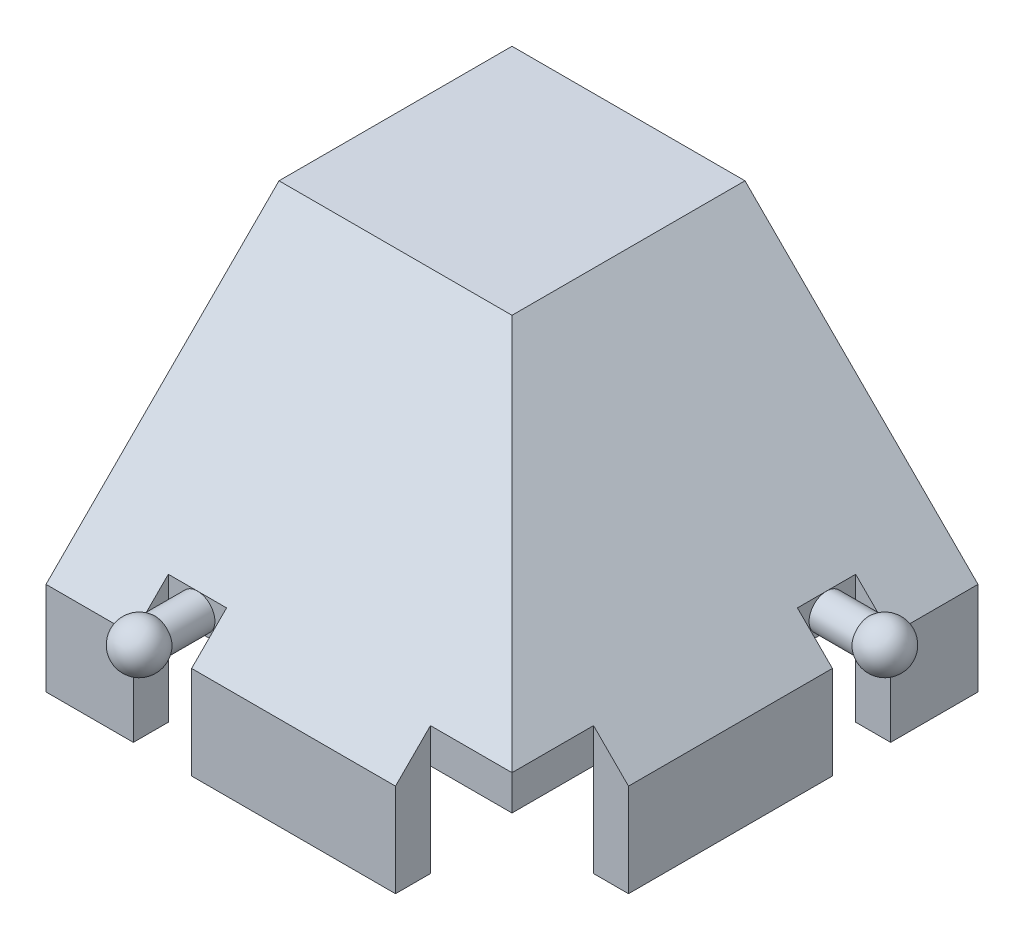
ISO-10303-21;
HEADER;
FILE_DESCRIPTION(('STEP AP214'),'2;1');
FILE_NAME('part.step','',(''),(''),'','','');
FILE_SCHEMA(('AUTOMOTIVE_DESIGN { 1 0 10303 214 1 1 1 1 }'));
ENDSEC;
DATA;
#1=APPLICATION_CONTEXT('core data for automotive mechanical design processes');
#2=APPLICATION_PROTOCOL_DEFINITION('international standard','automotive_design',2000,#1);
#3=PRODUCT_CONTEXT('',#1,'mechanical');
#4=PRODUCT('Part','Part','',(#3));
#5=PRODUCT_RELATED_PRODUCT_CATEGORY('part','',(#4));
#6=PRODUCT_DEFINITION_FORMATION('','',#4);
#7=PRODUCT_DEFINITION_CONTEXT('part definition',#1,'design');
#8=PRODUCT_DEFINITION('design','',#6,#7);
#9=PRODUCT_DEFINITION_SHAPE('','',#8);
#10=(LENGTH_UNIT() NAMED_UNIT(*) SI_UNIT(.MILLI.,.METRE.));
#11=(NAMED_UNIT(*) PLANE_ANGLE_UNIT() SI_UNIT($,.RADIAN.));
#12=(NAMED_UNIT(*) SI_UNIT($,.STERADIAN.) SOLID_ANGLE_UNIT());
#13=UNCERTAINTY_MEASURE_WITH_UNIT(LENGTH_MEASURE(1.E-05),#10,'distance_accuracy_value','');
#14=(GEOMETRIC_REPRESENTATION_CONTEXT(3) GLOBAL_UNCERTAINTY_ASSIGNED_CONTEXT((#13)) GLOBAL_UNIT_ASSIGNED_CONTEXT((#10,
#11,#12)) REPRESENTATION_CONTEXT('',''));
#15=CARTESIAN_POINT('',(0.,0.,0.));
#16=DIRECTION('',(0.,0.,1.));
#17=DIRECTION('',(1.,0.,0.));
#18=AXIS2_PLACEMENT_3D('',#15,#16,#17);
#19=CARTESIAN_POINT('',(15.3407897296246,20.,-8.37628865979381));
#20=DIRECTION('',(1.,0.,0.));
#21=DIRECTION('',(0.,0.,-1.));
#22=AXIS2_PLACEMENT_3D('',#19,#20,#21);
#23=PLANE('',#22);
#24=CARTESIAN_POINT('',(15.3407897296246,1.5,-5.87628865979381));
#25=DIRECTION('',(1.,0.,0.));
#26=DIRECTION('',(0.,0.,-1.));
#27=AXIS2_PLACEMENT_3D('',#24,#25,#26);
#28=CIRCLE('',#27,1.5);
#29=CARTESIAN_POINT('',(15.3407897296245,3.,-5.87628865979381));
#30=VERTEX_POINT('',#29);
#31=CARTESIAN_POINT('',(15.3407897296246,0.,-5.87628865979381));
#32=VERTEX_POINT('',#31);
#33=EDGE_CURVE('E240',#30,#32,#28,.T.);
#34=ORIENTED_EDGE('',*,*,#33,.F.);
#35=DIRECTION('',(0.,0.,-1.));
#36=VECTOR('',#35,1.);
#37=CARTESIAN_POINT('',(15.3407897296246,2.99999999999993,0.));
#38=LINE('',#37,#36);
#39=CARTESIAN_POINT('',(15.3407897296246,2.99999999999993,-3.37628865979381));
#40=VERTEX_POINT('',#39);
#41=EDGE_CURVE('E220',#40,#30,#38,.T.);
#42=ORIENTED_EDGE('',*,*,#41,.F.);
#43=DIRECTION('',(0.,-1.,0.));
#44=VECTOR('',#43,1.);
#45=CARTESIAN_POINT('',(15.3407897296246,20.,-3.37628865979381));
#46=LINE('',#45,#44);
#47=CARTESIAN_POINT('',(15.3407897296246,0.,-3.37628865979381));
#48=VERTEX_POINT('',#47);
#49=EDGE_CURVE('E383',#40,#48,#46,.T.);
#50=ORIENTED_EDGE('',*,*,#49,.T.);
#51=DIRECTION('',(0.,0.,1.));
#52=VECTOR('',#51,1.);
#53=CARTESIAN_POINT('',(15.3407897296246,0.,-8.37628865979381));
#54=LINE('',#53,#52);
#55=EDGE_CURVE('E236',#32,#48,#54,.T.);
#56=ORIENTED_EDGE('',*,*,#55,.F.);
#57=EDGE_LOOP('',(#34,#42,#50,#56));
#58=FACE_BOUND('',#57,.T.);
#59=ADVANCED_FACE('F47',(#58),#23,.T.);
#60=CARTESIAN_POINT('',(-11.6592102703754,1.49999999999993,26.1237113402062));
#61=DIRECTION('',(0.,0.,-1.));
#62=DIRECTION('',(-1.,0.,0.));
#63=AXIS2_PLACEMENT_3D('',#60,#61,#62);
#64=CYLINDRICAL_SURFACE('',#63,1.5);
#65=CARTESIAN_POINT('',(-11.6592102703754,1.49999999999993,21.1237113402062));
#66=DIRECTION('',(0.,0.,1.));
#67=DIRECTION('',(1.,0.,0.));
#68=AXIS2_PLACEMENT_3D('',#65,#66,#67);
#69=CIRCLE('',#68,1.5);
#70=CARTESIAN_POINT('',(-11.6592102703754,2.99999999999993,21.1237113402062));
#71=VERTEX_POINT('',#70);
#72=CARTESIAN_POINT('',(-11.6592102703754,0.,21.1237113402062));
#73=VERTEX_POINT('',#72);
#74=EDGE_CURVE('E246',#71,#73,#69,.T.);
#75=ORIENTED_EDGE('',*,*,#74,.T.);
#76=EDGE_CURVE('E73',#73,#71,#69,.T.);
#77=ORIENTED_EDGE('',*,*,#76,.T.);
#78=EDGE_LOOP('',(#75,#77));
#79=FACE_BOUND('',#78,.T.);
#80=CARTESIAN_POINT('',(-11.6592102703754,1.49999999999993,24.8008356846739));
#81=DIRECTION('',(0.,0.,1.));
#82=DIRECTION('',(1.,0.,0.));
#83=AXIS2_PLACEMENT_3D('',#80,#81,#82);
#84=CIRCLE('',#83,1.5);
#85=CARTESIAN_POINT('',(-10.1592102703754,1.49999999999993,24.8008356846739));
#86=VERTEX_POINT('',#85);
#87=EDGE_CURVE('E11',#86,#86,#84,.T.);
#88=ORIENTED_EDGE('',*,*,#87,.F.);
#89=EDGE_LOOP('',(#88));
#90=FACE_BOUND('',#89,.T.);
#91=ADVANCED_FACE('F515',(#79,#90),#64,.T.);
#92=CARTESIAN_POINT('',(-14.1592102703754,20.,21.1237113402062));
#93=DIRECTION('',(0.,0.,-1.));
#94=DIRECTION('',(-1.,0.,0.));
#95=AXIS2_PLACEMENT_3D('',#92,#93,#94);
#96=PLANE('',#95);
#97=ORIENTED_EDGE('',*,*,#74,.F.);
#98=DIRECTION('',(-1.,0.,0.));
#99=VECTOR('',#98,1.);
#100=CARTESIAN_POINT('',(0.,2.99999999999993,21.1237113402062));
#101=LINE('',#100,#99);
#102=CARTESIAN_POINT('',(-14.1592102703754,2.99999999999993,21.1237113402062));
#103=VERTEX_POINT('',#102);
#104=EDGE_CURVE('E486',#71,#103,#101,.T.);
#105=ORIENTED_EDGE('',*,*,#104,.T.);
#106=DIRECTION('',(0.,-1.,0.));
#107=VECTOR('',#106,1.);
#108=CARTESIAN_POINT('',(-14.1592102703754,20.,21.1237113402062));
#109=LINE('',#108,#107);
#110=CARTESIAN_POINT('',(-14.1592102703754,0.,21.1237113402062));
#111=VERTEX_POINT('',#110);
#112=EDGE_CURVE('E391',#103,#111,#109,.T.);
#113=ORIENTED_EDGE('',*,*,#112,.T.);
#114=DIRECTION('',(1.,0.,0.));
#115=VECTOR('',#114,1.);
#116=CARTESIAN_POINT('',(-14.1592102703754,0.,21.1237113402062));
#117=LINE('',#116,#115);
#118=EDGE_CURVE('E384',#111,#73,#117,.T.);
#119=ORIENTED_EDGE('',*,*,#118,.T.);
#120=EDGE_LOOP('',(#97,#105,#113,#119));
#121=FACE_BOUND('',#120,.T.);
#122=ADVANCED_FACE('F509',(#121),#96,.F.);
#123=CARTESIAN_POINT('',(0.,0.,0.));
#124=DIRECTION('',(0.,1.,0.));
#125=DIRECTION('',(0.,0.,1.));
#126=AXIS2_PLACEMENT_3D('',#123,#124,#125);
#127=PLANE('',#126);
#128=ORIENTED_EDGE('',*,*,#118,.F.);
#129=DIRECTION('',(-1.,0.,0.));
#130=VECTOR('',#129,1.);
#131=CARTESIAN_POINT('',(0.,0.,21.1237113402062));
#132=LINE('',#131,#130);
#133=CARTESIAN_POINT('',(-21.6592102703754,0.,21.1237113402062));
#134=VERTEX_POINT('',#133);
#135=EDGE_CURVE('E252',#111,#134,#132,.T.);
#136=ORIENTED_EDGE('',*,*,#135,.T.);
#137=DIRECTION('',(0.,0.,1.));
#138=VECTOR('',#137,1.);
#139=CARTESIAN_POINT('',(-21.6592102703754,0.,-15.8762886597938));
#140=LINE('',#139,#138);
#141=CARTESIAN_POINT('',(-21.6592102703754,0.,-15.8762886597938));
#142=VERTEX_POINT('',#141);
#143=EDGE_CURVE('E432',#142,#134,#140,.T.);
#144=ORIENTED_EDGE('',*,*,#143,.F.);
#145=DIRECTION('',(-1.,0.,0.));
#146=VECTOR('',#145,1.);
#147=CARTESIAN_POINT('',(-21.6592102703754,0.,-15.8762886597938));
#148=LINE('',#147,#146);
#149=CARTESIAN_POINT('',(15.3407897296246,0.,-15.8762886597938));
#150=VERTEX_POINT('',#149);
#151=EDGE_CURVE('E429',#150,#142,#148,.T.);
#152=ORIENTED_EDGE('',*,*,#151,.F.);
#153=DIRECTION('',(0.,0.,-1.));
#154=VECTOR('',#153,1.);
#155=CARTESIAN_POINT('',(15.3407897296246,0.,0.));
#156=LINE('',#155,#154);
#157=CARTESIAN_POINT('',(15.3407897296246,0.,-8.37628865979381));
#158=VERTEX_POINT('',#157);
#159=EDGE_CURVE('E291',#158,#150,#156,.T.);
#160=ORIENTED_EDGE('',*,*,#159,.F.);
#161=EDGE_CURVE('E389',#158,#32,#54,.T.);
#162=ORIENTED_EDGE('',*,*,#161,.T.);
#163=ORIENTED_EDGE('',*,*,#55,.T.);
#164=DIRECTION('',(0.,0.,-1.));
#165=VECTOR('',#164,1.);
#166=CARTESIAN_POINT('',(15.3407897296246,0.,0.));
#167=LINE('',#166,#165);
#168=CARTESIAN_POINT('',(15.3407897296246,0.,14.1237113402062));
#169=VERTEX_POINT('',#168);
#170=EDGE_CURVE('E256',#169,#48,#167,.T.);
#171=ORIENTED_EDGE('',*,*,#170,.F.);
#172=DIRECTION('',(0.,0.,1.));
#173=VECTOR('',#172,1.);
#174=CARTESIAN_POINT('',(15.3407897296246,0.,0.));
#175=LINE('',#174,#173);
#176=CARTESIAN_POINT('',(15.3407897296246,0.,21.1237113402062));
#177=VERTEX_POINT('',#176);
#178=EDGE_CURVE('E393',#169,#177,#175,.T.);
#179=ORIENTED_EDGE('',*,*,#178,.T.);
#180=DIRECTION('',(1.,0.,0.));
#181=VECTOR('',#180,1.);
#182=CARTESIAN_POINT('',(0.,0.,21.1237113402062));
#183=LINE('',#182,#181);
#184=CARTESIAN_POINT('',(8.34078972962457,0.,21.1237113402062));
#185=VERTEX_POINT('',#184);
#186=EDGE_CURVE('E408',#185,#177,#183,.T.);
#187=ORIENTED_EDGE('',*,*,#186,.F.);
#188=DIRECTION('',(1.,0.,0.));
#189=VECTOR('',#188,1.);
#190=CARTESIAN_POINT('',(0.,0.,21.1237113402062));
#191=LINE('',#190,#189);
#192=CARTESIAN_POINT('',(-9.15921027037543,0.,21.1237113402062));
#193=VERTEX_POINT('',#192);
#194=EDGE_CURVE('E290',#193,#185,#191,.T.);
#195=ORIENTED_EDGE('',*,*,#194,.F.);
#196=EDGE_CURVE('E399',#73,#193,#117,.T.);
#197=ORIENTED_EDGE('',*,*,#196,.F.);
#198=EDGE_LOOP('',(#128,#136,#144,#152,#160,#162,#163,#171,#179,#187,#195,#197));
#199=FACE_BOUND('',#198,.T.);
#200=ADVANCED_FACE('F531',(#199),#127,.F.);
#201=CARTESIAN_POINT('',(-1.65921027037544,20.,0.));
#202=DIRECTION('',(0.707106781186549,0.707106781186546,0.));
#203=DIRECTION('',(0.,0.,1.));
#204=AXIS2_PLACEMENT_3D('',#201,#202,#203);
#205=PLANE('',#204);
#206=DIRECTION('',(0.,0.,-1.));
#207=VECTOR('',#206,1.);
#208=CARTESIAN_POINT('',(18.3407897296246,0.,-15.8762886597938));
#209=LINE('',#208,#207);
#210=CARTESIAN_POINT('',(18.3407897296246,0.,14.1237113402062));
#211=VERTEX_POINT('',#210);
#212=CARTESIAN_POINT('',(18.3407897296246,0.,-3.37628865979381));
#213=VERTEX_POINT('',#212);
#214=EDGE_CURVE('E448',#211,#213,#209,.T.);
#215=ORIENTED_EDGE('',*,*,#214,.T.);
#216=DIRECTION('',(-0.707106781186546,0.707106781186549,0.));
#217=VECTOR('',#216,1.);
#218=CARTESIAN_POINT('',(-1.65921027037544,20.,-3.37628865979381));
#219=LINE('',#218,#217);
#220=EDGE_CURVE('E225',#213,#40,#219,.T.);
#221=ORIENTED_EDGE('',*,*,#220,.T.);
#222=ORIENTED_EDGE('',*,*,#41,.T.);
#223=CARTESIAN_POINT('',(15.3407897296246,2.99999999999993,-8.37628865979381));
#224=VERTEX_POINT('',#223);
#225=EDGE_CURVE('E219',#30,#224,#38,.T.);
#226=ORIENTED_EDGE('',*,*,#225,.T.);
#227=DIRECTION('',(-0.707106781186546,0.707106781186549,0.));
#228=VECTOR('',#227,1.);
#229=CARTESIAN_POINT('',(-1.65921027037544,20.,-8.37628865979381));
#230=LINE('',#229,#228);
#231=CARTESIAN_POINT('',(18.3407897296246,0.,-8.37628865979381));
#232=VERTEX_POINT('',#231);
#233=EDGE_CURVE('E227',#232,#224,#230,.T.);
#234=ORIENTED_EDGE('',*,*,#233,.F.);
#235=CARTESIAN_POINT('',(18.3407897296246,0.,-15.8762886597938));
#236=VERTEX_POINT('',#235);
#237=EDGE_CURVE('E444',#232,#236,#209,.T.);
#238=ORIENTED_EDGE('',*,*,#237,.T.);
#239=DIRECTION('',(0.707106781186546,-0.707106781186549,0.));
#240=VECTOR('',#239,1.);
#241=CARTESIAN_POINT('',(-1.65921027037544,20.,-15.8762886597938));
#242=LINE('',#241,#240);
#243=CARTESIAN_POINT('',(-1.65921027037544,20.,-15.8762886597938));
#244=VERTEX_POINT('',#243);
#245=EDGE_CURVE('E459',#244,#236,#242,.T.);
#246=ORIENTED_EDGE('',*,*,#245,.F.);
#247=DIRECTION('',(0.,0.,-1.));
#248=VECTOR('',#247,1.);
#249=CARTESIAN_POINT('',(-1.65921027037544,20.,-15.8762886597938));
#250=LINE('',#249,#248);
#251=CARTESIAN_POINT('',(-1.65921027037544,20.,4.12371134020618));
#252=VERTEX_POINT('',#251);
#253=EDGE_CURVE('E452',#252,#244,#250,.T.);
#254=ORIENTED_EDGE('',*,*,#253,.F.);
#255=DIRECTION('',(-0.577350269189625,0.577350269189627,-0.577350269189625));
#256=VECTOR('',#255,1.);
#257=CARTESIAN_POINT('',(-1.1061401802503,19.4469299098749,4.67678143033132));
#258=LINE('',#257,#256);
#259=CARTESIAN_POINT('',(15.3407897296246,2.99999999999993,21.1237113402062));
#260=VERTEX_POINT('',#259);
#261=EDGE_CURVE('E424',#252,#260,#258,.F.);
#262=ORIENTED_EDGE('',*,*,#261,.T.);
#263=DIRECTION('',(0.,0.,-1.));
#264=VECTOR('',#263,1.);
#265=CARTESIAN_POINT('',(15.3407897296246,2.99999999999993,0.));
#266=LINE('',#265,#264);
#267=CARTESIAN_POINT('',(15.3407897296246,2.99999999999993,14.1237113402062));
#268=VERTEX_POINT('',#267);
#269=EDGE_CURVE('E232',#260,#268,#266,.T.);
#270=ORIENTED_EDGE('',*,*,#269,.T.);
#271=DIRECTION('',(-0.707106781186546,0.707106781186549,0.));
#272=VECTOR('',#271,1.);
#273=CARTESIAN_POINT('',(-1.65921027037544,20.,14.1237113402062));
#274=LINE('',#273,#272);
#275=EDGE_CURVE('E468',#211,#268,#274,.T.);
#276=ORIENTED_EDGE('',*,*,#275,.F.);
#277=EDGE_LOOP('',(#215,#221,#222,#226,#234,#238,#246,#254,#262,#270,#276));
#278=FACE_BOUND('',#277,.T.);
#279=ADVANCED_FACE('F218',(#278),#205,.T.);
#280=CARTESIAN_POINT('',(-21.6592102703754,20.,-15.8762886597938));
#281=DIRECTION('',(1.,0.,0.));
#282=DIRECTION('',(0.,0.,-1.));
#283=AXIS2_PLACEMENT_3D('',#280,#281,#282);
#284=PLANE('',#283);
#285=ORIENTED_EDGE('',*,*,#143,.T.);
#286=DIRECTION('',(0.,1.,0.));
#287=VECTOR('',#286,1.);
#288=CARTESIAN_POINT('',(-21.6592102703754,-8.,21.1237113402062));
#289=LINE('',#288,#287);
#290=CARTESIAN_POINT('',(-21.6592102703754,-8.,21.1237113402062));
#291=VERTEX_POINT('',#290);
#292=EDGE_CURVE('E331',#291,#134,#289,.T.);
#293=ORIENTED_EDGE('',*,*,#292,.F.);
#294=DIRECTION('',(0.,0.,-1.));
#295=VECTOR('',#294,1.);
#296=CARTESIAN_POINT('',(-21.6592102703754,-8.,0.));
#297=LINE('',#296,#295);
#298=CARTESIAN_POINT('',(-21.6592102703754,-8.,24.1237113402062));
#299=VERTEX_POINT('',#298);
#300=EDGE_CURVE('E332',#299,#291,#297,.T.);
#301=ORIENTED_EDGE('',*,*,#300,.F.);
#302=DIRECTION('',(0.,1.,0.));
#303=VECTOR('',#302,1.);
#304=CARTESIAN_POINT('',(-21.6592102703754,-8.,24.1237113402062));
#305=LINE('',#304,#303);
#306=CARTESIAN_POINT('',(-21.6592102703754,0.,24.1237113402062));
#307=VERTEX_POINT('',#306);
#308=EDGE_CURVE('E336',#299,#307,#305,.T.);
#309=ORIENTED_EDGE('',*,*,#308,.T.);
#310=DIRECTION('',(0.,0.707106781186549,-0.707106781186546));
#311=VECTOR('',#310,1.);
#312=CARTESIAN_POINT('',(-21.6592102703754,20.,4.12371134020618));
#313=LINE('',#312,#311);
#314=CARTESIAN_POINT('',(-21.6592102703754,20.,4.12371134020618));
#315=VERTEX_POINT('',#314);
#316=EDGE_CURVE('E462',#307,#315,#313,.T.);
#317=ORIENTED_EDGE('',*,*,#316,.T.);
#318=DIRECTION('',(0.,0.,1.));
#319=VECTOR('',#318,1.);
#320=CARTESIAN_POINT('',(-21.6592102703754,20.,-15.8762886597938));
#321=LINE('',#320,#319);
#322=CARTESIAN_POINT('',(-21.6592102703754,20.,-15.8762886597938));
#323=VERTEX_POINT('',#322);
#324=EDGE_CURVE('E422',#323,#315,#321,.T.);
#325=ORIENTED_EDGE('',*,*,#324,.F.);
#326=DIRECTION('',(0.,-1.,0.));
#327=VECTOR('',#326,1.);
#328=CARTESIAN_POINT('',(-21.6592102703754,20.,-15.8762886597938));
#329=LINE('',#328,#327);
#330=EDGE_CURVE('E433',#323,#142,#329,.T.);
#331=ORIENTED_EDGE('',*,*,#330,.T.);
#332=EDGE_LOOP('',(#285,#293,#301,#309,#317,#325,#331));
#333=FACE_BOUND('',#332,.T.);
#334=ADVANCED_FACE('F574',(#333),#284,.F.);
#335=CARTESIAN_POINT('',(-21.6592102703754,20.,-15.8762886597938));
#336=DIRECTION('',(0.,0.,1.));
#337=DIRECTION('',(1.,0.,0.));
#338=AXIS2_PLACEMENT_3D('',#335,#336,#337);
#339=PLANE('',#338);
#340=DIRECTION('',(-1.,0.,0.));
#341=VECTOR('',#340,1.);
#342=CARTESIAN_POINT('',(-21.6592102703754,20.,-15.8762886597938));
#343=LINE('',#342,#341);
#344=EDGE_CURVE('E427',#244,#323,#343,.T.);
#345=ORIENTED_EDGE('',*,*,#344,.F.);
#346=ORIENTED_EDGE('',*,*,#245,.T.);
#347=DIRECTION('',(0.,1.,0.));
#348=VECTOR('',#347,1.);
#349=CARTESIAN_POINT('',(18.3407897296246,-8.,-15.8762886597938));
#350=LINE('',#349,#348);
#351=CARTESIAN_POINT('',(18.3407897296246,-8.,-15.8762886597938));
#352=VERTEX_POINT('',#351);
#353=EDGE_CURVE('E309',#352,#236,#350,.T.);
#354=ORIENTED_EDGE('',*,*,#353,.F.);
#355=DIRECTION('',(1.,0.,0.));
#356=VECTOR('',#355,1.);
#357=CARTESIAN_POINT('',(0.,-8.,-15.8762886597938));
#358=LINE('',#357,#356);
#359=CARTESIAN_POINT('',(15.3407897296246,-8.,-15.8762886597938));
#360=VERTEX_POINT('',#359);
#361=EDGE_CURVE('E298',#360,#352,#358,.T.);
#362=ORIENTED_EDGE('',*,*,#361,.F.);
#363=DIRECTION('',(0.,1.,0.));
#364=VECTOR('',#363,1.);
#365=CARTESIAN_POINT('',(15.3407897296246,-8.,-15.8762886597938));
#366=LINE('',#365,#364);
#367=EDGE_CURVE('E314',#360,#150,#366,.T.);
#368=ORIENTED_EDGE('',*,*,#367,.T.);
#369=ORIENTED_EDGE('',*,*,#151,.T.);
#370=ORIENTED_EDGE('',*,*,#330,.F.);
#371=EDGE_LOOP('',(#345,#346,#354,#362,#368,#369,#370));
#372=FACE_BOUND('',#371,.T.);
#373=ADVANCED_FACE('F570',(#372),#339,.F.);
#374=CARTESIAN_POINT('',(0.,20.,0.));
#375=DIRECTION('',(0.,1.,0.));
#376=DIRECTION('',(0.,0.,1.));
#377=AXIS2_PLACEMENT_3D('',#374,#375,#376);
#378=PLANE('',#377);
#379=DIRECTION('',(1.,0.,0.));
#380=VECTOR('',#379,1.);
#381=CARTESIAN_POINT('',(18.3407897296246,20.,4.12371134020618));
#382=LINE('',#381,#380);
#383=EDGE_CURVE('E455',#315,#252,#382,.T.);
#384=ORIENTED_EDGE('',*,*,#383,.T.);
#385=ORIENTED_EDGE('',*,*,#253,.T.);
#386=ORIENTED_EDGE('',*,*,#344,.T.);
#387=ORIENTED_EDGE('',*,*,#324,.T.);
#388=EDGE_LOOP('',(#384,#385,#386,#387));
#389=FACE_BOUND('',#388,.T.);
#390=ADVANCED_FACE('F564',(#389),#378,.T.);
#391=CARTESIAN_POINT('',(0.,20.,4.12371134020618));
#392=DIRECTION('',(0.,0.707106781186546,0.707106781186549));
#393=DIRECTION('',(-1.,0.,0.));
#394=AXIS2_PLACEMENT_3D('',#391,#392,#393);
#395=PLANE('',#394);
#396=DIRECTION('',(0.,0.707106781186549,-0.707106781186546));
#397=VECTOR('',#396,1.);
#398=CARTESIAN_POINT('',(-9.15921027037543,20.,4.12371134020618));
#399=LINE('',#398,#397);
#400=CARTESIAN_POINT('',(-9.15921027037543,0.,24.1237113402062));
#401=VERTEX_POINT('',#400);
#402=CARTESIAN_POINT('',(-9.15921027037543,2.99999999999993,21.1237113402062));
#403=VERTEX_POINT('',#402);
#404=EDGE_CURVE('E58',#401,#403,#399,.T.);
#405=ORIENTED_EDGE('',*,*,#404,.F.);
#406=DIRECTION('',(1.,0.,0.));
#407=VECTOR('',#406,1.);
#408=CARTESIAN_POINT('',(-21.6592102703754,0.,24.1237113402062));
#409=LINE('',#408,#407);
#410=CARTESIAN_POINT('',(8.34078972962457,0.,24.1237113402062));
#411=VERTEX_POINT('',#410);
#412=EDGE_CURVE('E437',#401,#411,#409,.T.);
#413=ORIENTED_EDGE('',*,*,#412,.T.);
#414=DIRECTION('',(0.,-0.707106781186549,0.707106781186546));
#415=VECTOR('',#414,1.);
#416=CARTESIAN_POINT('',(8.34078972962457,20.,4.12371134020618));
#417=LINE('',#416,#415);
#418=CARTESIAN_POINT('',(8.34078972962457,2.99999999999994,21.1237113402062));
#419=VERTEX_POINT('',#418);
#420=EDGE_CURVE('E479',#419,#411,#417,.T.);
#421=ORIENTED_EDGE('',*,*,#420,.F.);
#422=DIRECTION('',(-1.,0.,0.));
#423=VECTOR('',#422,1.);
#424=CARTESIAN_POINT('',(0.,2.99999999999993,21.1237113402062));
#425=LINE('',#424,#423);
#426=EDGE_CURVE('E414',#260,#419,#425,.T.);
#427=ORIENTED_EDGE('',*,*,#426,.F.);
#428=ORIENTED_EDGE('',*,*,#261,.F.);
#429=ORIENTED_EDGE('',*,*,#383,.F.);
#430=ORIENTED_EDGE('',*,*,#316,.F.);
#431=CARTESIAN_POINT('',(-14.1592102703754,0.,24.1237113402062));
#432=VERTEX_POINT('',#431);
#433=EDGE_CURVE('E438',#307,#432,#409,.T.);
#434=ORIENTED_EDGE('',*,*,#433,.T.);
#435=DIRECTION('',(0.,0.707106781186549,-0.707106781186546));
#436=VECTOR('',#435,1.);
#437=CARTESIAN_POINT('',(-14.1592102703754,20.,4.12371134020618));
#438=LINE('',#437,#436);
#439=EDGE_CURVE('E485',#432,#103,#438,.T.);
#440=ORIENTED_EDGE('',*,*,#439,.T.);
#441=ORIENTED_EDGE('',*,*,#104,.F.);
#442=EDGE_CURVE('E490',#403,#71,#101,.T.);
#443=ORIENTED_EDGE('',*,*,#442,.F.);
#444=EDGE_LOOP('',(#405,#413,#421,#427,#428,#429,#430,#434,#440,#441,#443));
#445=FACE_BOUND('',#444,.T.);
#446=ADVANCED_FACE('F55',(#445),#395,.T.);
#447=CARTESIAN_POINT('',(15.3407897296246,20.,0.));
#448=DIRECTION('',(1.,0.,0.));
#449=DIRECTION('',(0.,0.,-1.));
#450=AXIS2_PLACEMENT_3D('',#447,#448,#449);
#451=PLANE('',#450);
#452=DIRECTION('',(0.,-1.,0.));
#453=VECTOR('',#452,1.);
#454=CARTESIAN_POINT('',(15.3407897296246,20.,21.1237113402062));
#455=LINE('',#454,#453);
#456=EDGE_CURVE('E413',#260,#177,#455,.T.);
#457=ORIENTED_EDGE('',*,*,#456,.T.);
#458=ORIENTED_EDGE('',*,*,#178,.F.);
#459=DIRECTION('',(0.,-1.,0.));
#460=VECTOR('',#459,1.);
#461=CARTESIAN_POINT('',(15.3407897296246,20.,14.1237113402062));
#462=LINE('',#461,#460);
#463=EDGE_CURVE('E406',#268,#169,#462,.T.);
#464=ORIENTED_EDGE('',*,*,#463,.F.);
#465=ORIENTED_EDGE('',*,*,#269,.F.);
#466=EDGE_LOOP('',(#457,#458,#464,#465));
#467=FACE_BOUND('',#466,.T.);
#468=ADVANCED_FACE('F539',(#467),#451,.T.);
#469=CARTESIAN_POINT('',(0.,20.,21.1237113402062));
#470=DIRECTION('',(0.,0.,-1.));
#471=DIRECTION('',(-1.,0.,0.));
#472=AXIS2_PLACEMENT_3D('',#469,#470,#471);
#473=PLANE('',#472);
#474=ORIENTED_EDGE('',*,*,#426,.T.);
#475=DIRECTION('',(0.,-1.,0.));
#476=VECTOR('',#475,1.);
#477=CARTESIAN_POINT('',(8.34078972962457,20.,21.1237113402062));
#478=LINE('',#477,#476);
#479=EDGE_CURVE('E412',#419,#185,#478,.T.);
#480=ORIENTED_EDGE('',*,*,#479,.T.);
#481=ORIENTED_EDGE('',*,*,#186,.T.);
#482=ORIENTED_EDGE('',*,*,#456,.F.);
#483=EDGE_LOOP('',(#474,#480,#481,#482));
#484=FACE_BOUND('',#483,.T.);
#485=ADVANCED_FACE('F542',(#484),#473,.F.);
#486=CARTESIAN_POINT('',(8.34078972962457,20.,0.));
#487=DIRECTION('',(-1.,0.,0.));
#488=DIRECTION('',(0.,0.,1.));
#489=AXIS2_PLACEMENT_3D('',#486,#487,#488);
#490=PLANE('',#489);
#491=ORIENTED_EDGE('',*,*,#420,.T.);
#492=DIRECTION('',(0.,1.,0.));
#493=VECTOR('',#492,1.);
#494=CARTESIAN_POINT('',(8.34078972962457,-8.,24.1237113402062));
#495=LINE('',#494,#493);
#496=CARTESIAN_POINT('',(8.34078972962457,-8.,24.1237113402062));
#497=VERTEX_POINT('',#496);
#498=EDGE_CURVE('E369',#497,#411,#495,.T.);
#499=ORIENTED_EDGE('',*,*,#498,.F.);
#500=DIRECTION('',(0.,0.,1.));
#501=VECTOR('',#500,1.);
#502=CARTESIAN_POINT('',(8.34078972962457,-8.,0.));
#503=LINE('',#502,#501);
#504=CARTESIAN_POINT('',(8.34078972962457,-8.,21.1237113402062));
#505=VERTEX_POINT('',#504);
#506=EDGE_CURVE('E358',#505,#497,#503,.T.);
#507=ORIENTED_EDGE('',*,*,#506,.F.);
#508=DIRECTION('',(0.,1.,0.));
#509=VECTOR('',#508,1.);
#510=CARTESIAN_POINT('',(8.34078972962457,-8.,21.1237113402062));
#511=LINE('',#510,#509);
#512=EDGE_CURVE('E373',#505,#185,#511,.T.);
#513=ORIENTED_EDGE('',*,*,#512,.T.);
#514=ORIENTED_EDGE('',*,*,#479,.F.);
#515=EDGE_LOOP('',(#491,#499,#507,#513,#514));
#516=FACE_BOUND('',#515,.T.);
#517=ADVANCED_FACE('F552',(#516),#490,.F.);
#518=CARTESIAN_POINT('',(0.,20.,14.1237113402062));
#519=DIRECTION('',(0.,0.,-1.));
#520=DIRECTION('',(-1.,0.,0.));
#521=AXIS2_PLACEMENT_3D('',#518,#519,#520);
#522=PLANE('',#521);
#523=ORIENTED_EDGE('',*,*,#275,.T.);
#524=ORIENTED_EDGE('',*,*,#463,.T.);
#525=DIRECTION('',(0.,1.,0.));
#526=VECTOR('',#525,1.);
#527=CARTESIAN_POINT('',(15.3407897296246,-8.,14.1237113402062));
#528=LINE('',#527,#526);
#529=CARTESIAN_POINT('',(15.3407897296246,-8.,14.1237113402062));
#530=VERTEX_POINT('',#529);
#531=EDGE_CURVE('E282',#530,#169,#528,.T.);
#532=ORIENTED_EDGE('',*,*,#531,.F.);
#533=DIRECTION('',(-1.,0.,0.));
#534=VECTOR('',#533,1.);
#535=CARTESIAN_POINT('',(0.,-8.,14.1237113402062));
#536=LINE('',#535,#534);
#537=CARTESIAN_POINT('',(18.3407897296246,-8.,14.1237113402062));
#538=VERTEX_POINT('',#537);
#539=EDGE_CURVE('E251',#538,#530,#536,.T.);
#540=ORIENTED_EDGE('',*,*,#539,.F.);
#541=DIRECTION('',(0.,1.,0.));
#542=VECTOR('',#541,1.);
#543=CARTESIAN_POINT('',(18.3407897296246,-8.,14.1237113402062));
#544=LINE('',#543,#542);
#545=EDGE_CURVE('E270',#538,#211,#544,.T.);
#546=ORIENTED_EDGE('',*,*,#545,.T.);
#547=EDGE_LOOP('',(#523,#524,#532,#540,#546));
#548=FACE_BOUND('',#547,.T.);
#549=ADVANCED_FACE('F540',(#548),#522,.F.);
#550=CARTESIAN_POINT('',(15.3407897296246,20.,-3.37628865979381));
#551=DIRECTION('',(0.,0.,-1.));
#552=DIRECTION('',(-1.,0.,0.));
#553=AXIS2_PLACEMENT_3D('',#550,#551,#552);
#554=PLANE('',#553);
#555=ORIENTED_EDGE('',*,*,#220,.F.);
#556=DIRECTION('',(0.,1.,0.));
#557=VECTOR('',#556,1.);
#558=CARTESIAN_POINT('',(18.3407897296246,-8.,-3.37628865979381));
#559=LINE('',#558,#557);
#560=CARTESIAN_POINT('',(18.3407897296246,-8.,-3.37628865979381));
#561=VERTEX_POINT('',#560);
#562=EDGE_CURVE('E274',#561,#213,#559,.T.);
#563=ORIENTED_EDGE('',*,*,#562,.F.);
#564=DIRECTION('',(1.,0.,0.));
#565=VECTOR('',#564,1.);
#566=CARTESIAN_POINT('',(0.,-8.,-3.37628865979381));
#567=LINE('',#566,#565);
#568=CARTESIAN_POINT('',(15.3407897296246,-8.,-3.37628865979381));
#569=VERTEX_POINT('',#568);
#570=EDGE_CURVE('E261',#569,#561,#567,.T.);
#571=ORIENTED_EDGE('',*,*,#570,.F.);
#572=DIRECTION('',(0.,1.,0.));
#573=VECTOR('',#572,1.);
#574=CARTESIAN_POINT('',(15.3407897296246,-8.,-3.37628865979381));
#575=LINE('',#574,#573);
#576=EDGE_CURVE('E276',#569,#48,#575,.T.);
#577=ORIENTED_EDGE('',*,*,#576,.T.);
#578=ORIENTED_EDGE('',*,*,#49,.F.);
#579=EDGE_LOOP('',(#555,#563,#571,#577,#578));
#580=FACE_BOUND('',#579,.T.);
#581=ADVANCED_FACE('F527',(#580),#554,.T.);
#582=CARTESIAN_POINT('',(15.3407897296246,20.,-8.37628865979381));
#583=DIRECTION('',(0.,0.,-1.));
#584=DIRECTION('',(-1.,0.,0.));
#585=AXIS2_PLACEMENT_3D('',#582,#583,#584);
#586=PLANE('',#585);
#587=ORIENTED_EDGE('',*,*,#233,.T.);
#588=DIRECTION('',(0.,-1.,0.));
#589=VECTOR('',#588,1.);
#590=CARTESIAN_POINT('',(15.3407897296246,20.,-8.37628865979381));
#591=LINE('',#590,#589);
#592=EDGE_CURVE('E235',#224,#158,#591,.T.);
#593=ORIENTED_EDGE('',*,*,#592,.T.);
#594=DIRECTION('',(0.,1.,0.));
#595=VECTOR('',#594,1.);
#596=CARTESIAN_POINT('',(15.3407897296246,-8.,-8.37628865979381));
#597=LINE('',#596,#595);
#598=CARTESIAN_POINT('',(15.3407897296246,-8.,-8.37628865979381));
#599=VERTEX_POINT('',#598);
#600=EDGE_CURVE('E271',#599,#158,#597,.T.);
#601=ORIENTED_EDGE('',*,*,#600,.F.);
#602=DIRECTION('',(-1.,0.,0.));
#603=VECTOR('',#602,1.);
#604=CARTESIAN_POINT('',(0.,-8.,-8.37628865979381));
#605=LINE('',#604,#603);
#606=CARTESIAN_POINT('',(18.3407897296246,-8.,-8.37628865979381));
#607=VERTEX_POINT('',#606);
#608=EDGE_CURVE('E286',#607,#599,#605,.T.);
#609=ORIENTED_EDGE('',*,*,#608,.F.);
#610=DIRECTION('',(0.,1.,0.));
#611=VECTOR('',#610,1.);
#612=CARTESIAN_POINT('',(18.3407897296246,-8.,-8.37628865979381));
#613=LINE('',#612,#611);
#614=EDGE_CURVE('E305',#607,#232,#613,.T.);
#615=ORIENTED_EDGE('',*,*,#614,.T.);
#616=EDGE_LOOP('',(#587,#593,#601,#609,#615));
#617=FACE_BOUND('',#616,.T.);
#618=ADVANCED_FACE('F612',(#617),#586,.F.);
#619=EDGE_CURVE('E70',#32,#30,#28,.T.);
#620=ORIENTED_EDGE('',*,*,#619,.F.);
#621=ORIENTED_EDGE('',*,*,#161,.F.);
#622=ORIENTED_EDGE('',*,*,#592,.F.);
#623=ORIENTED_EDGE('',*,*,#225,.F.);
#624=EDGE_LOOP('',(#620,#621,#622,#623));
#625=FACE_BOUND('',#624,.T.);
#626=ADVANCED_FACE('F226',(#625),#23,.T.);
#627=CARTESIAN_POINT('',(-9.15921027037543,20.,21.1237113402062));
#628=DIRECTION('',(1.,0.,0.));
#629=DIRECTION('',(0.,0.,-1.));
#630=AXIS2_PLACEMENT_3D('',#627,#628,#629);
#631=PLANE('',#630);
#632=ORIENTED_EDGE('',*,*,#404,.T.);
#633=DIRECTION('',(0.,-1.,0.));
#634=VECTOR('',#633,1.);
#635=CARTESIAN_POINT('',(-9.15921027037543,20.,21.1237113402062));
#636=LINE('',#635,#634);
#637=EDGE_CURVE('E381',#403,#193,#636,.T.);
#638=ORIENTED_EDGE('',*,*,#637,.T.);
#639=DIRECTION('',(0.,1.,0.));
#640=VECTOR('',#639,1.);
#641=CARTESIAN_POINT('',(-9.15921027037543,-8.,21.1237113402062));
#642=LINE('',#641,#640);
#643=CARTESIAN_POINT('',(-9.15921027037543,-8.,21.1237113402062));
#644=VERTEX_POINT('',#643);
#645=EDGE_CURVE('E380',#644,#193,#642,.T.);
#646=ORIENTED_EDGE('',*,*,#645,.F.);
#647=DIRECTION('',(0.,0.,-1.));
#648=VECTOR('',#647,1.);
#649=CARTESIAN_POINT('',(-9.15921027037543,-8.,0.));
#650=LINE('',#649,#648);
#651=CARTESIAN_POINT('',(-9.15921027037543,-8.,24.1237113402062));
#652=VERTEX_POINT('',#651);
#653=EDGE_CURVE('E349',#652,#644,#650,.T.);
#654=ORIENTED_EDGE('',*,*,#653,.F.);
#655=DIRECTION('',(0.,1.,0.));
#656=VECTOR('',#655,1.);
#657=CARTESIAN_POINT('',(-9.15921027037543,-8.,24.1237113402062));
#658=LINE('',#657,#656);
#659=EDGE_CURVE('E362',#652,#401,#658,.T.);
#660=ORIENTED_EDGE('',*,*,#659,.T.);
#661=EDGE_LOOP('',(#632,#638,#646,#654,#660));
#662=FACE_BOUND('',#661,.T.);
#663=ADVANCED_FACE('F492',(#662),#631,.F.);
#664=ORIENTED_EDGE('',*,*,#76,.F.);
#665=ORIENTED_EDGE('',*,*,#196,.T.);
#666=ORIENTED_EDGE('',*,*,#637,.F.);
#667=ORIENTED_EDGE('',*,*,#442,.T.);
#668=EDGE_LOOP('',(#664,#665,#666,#667));
#669=FACE_BOUND('',#668,.T.);
#670=ADVANCED_FACE('F503',(#669),#96,.F.);
#671=CARTESIAN_POINT('',(-14.1592102703754,20.,21.1237113402062));
#672=DIRECTION('',(1.,0.,0.));
#673=DIRECTION('',(0.,0.,-1.));
#674=AXIS2_PLACEMENT_3D('',#671,#672,#673);
#675=PLANE('',#674);
#676=ORIENTED_EDGE('',*,*,#439,.F.);
#677=DIRECTION('',(0.,1.,0.));
#678=VECTOR('',#677,1.);
#679=CARTESIAN_POINT('',(-14.1592102703754,-8.,24.1237113402062));
#680=LINE('',#679,#678);
#681=CARTESIAN_POINT('',(-14.1592102703754,-8.,24.1237113402062));
#682=VERTEX_POINT('',#681);
#683=EDGE_CURVE('E344',#682,#432,#680,.T.);
#684=ORIENTED_EDGE('',*,*,#683,.F.);
#685=DIRECTION('',(0.,0.,1.));
#686=VECTOR('',#685,1.);
#687=CARTESIAN_POINT('',(-14.1592102703754,-8.,0.));
#688=LINE('',#687,#686);
#689=CARTESIAN_POINT('',(-14.1592102703754,-8.,21.1237113402062));
#690=VERTEX_POINT('',#689);
#691=EDGE_CURVE('E324',#690,#682,#688,.T.);
#692=ORIENTED_EDGE('',*,*,#691,.F.);
#693=DIRECTION('',(0.,1.,0.));
#694=VECTOR('',#693,1.);
#695=CARTESIAN_POINT('',(-14.1592102703754,-8.,21.1237113402062));
#696=LINE('',#695,#694);
#697=EDGE_CURVE('E308',#690,#111,#696,.T.);
#698=ORIENTED_EDGE('',*,*,#697,.T.);
#699=ORIENTED_EDGE('',*,*,#112,.F.);
#700=EDGE_LOOP('',(#676,#684,#692,#698,#699));
#701=FACE_BOUND('',#700,.T.);
#702=ADVANCED_FACE('F588',(#701),#675,.T.);
#703=CARTESIAN_POINT('',(0.,-8.,21.1237113402062));
#704=DIRECTION('',(0.,0.,1.));
#705=DIRECTION('',(1.,0.,0.));
#706=AXIS2_PLACEMENT_3D('',#703,#704,#705);
#707=PLANE('',#706);
#708=ORIENTED_EDGE('',*,*,#194,.T.);
#709=ORIENTED_EDGE('',*,*,#512,.F.);
#710=DIRECTION('',(1.,0.,0.));
#711=VECTOR('',#710,1.);
#712=CARTESIAN_POINT('',(0.,-8.,21.1237113402062));
#713=LINE('',#712,#711);
#714=EDGE_CURVE('E352',#644,#505,#713,.T.);
#715=ORIENTED_EDGE('',*,*,#714,.F.);
#716=ORIENTED_EDGE('',*,*,#645,.T.);
#717=EDGE_LOOP('',(#708,#709,#715,#716));
#718=FACE_BOUND('',#717,.T.);
#719=ADVANCED_FACE('F547',(#718),#707,.F.);
#720=CARTESIAN_POINT('',(0.,-8.,24.1237113402062));
#721=DIRECTION('',(0.,0.,-1.));
#722=DIRECTION('',(-1.,0.,0.));
#723=AXIS2_PLACEMENT_3D('',#720,#721,#722);
#724=PLANE('',#723);
#725=ORIENTED_EDGE('',*,*,#412,.F.);
#726=ORIENTED_EDGE('',*,*,#659,.F.);
#727=DIRECTION('',(-1.,0.,0.));
#728=VECTOR('',#727,1.);
#729=CARTESIAN_POINT('',(0.,-8.,24.1237113402062));
#730=LINE('',#729,#728);
#731=EDGE_CURVE('E359',#497,#652,#730,.T.);
#732=ORIENTED_EDGE('',*,*,#731,.F.);
#733=ORIENTED_EDGE('',*,*,#498,.T.);
#734=EDGE_LOOP('',(#725,#726,#732,#733));
#735=FACE_BOUND('',#734,.T.);
#736=ADVANCED_FACE('F557',(#735),#724,.F.);
#737=CARTESIAN_POINT('',(0.,-8.,0.));
#738=DIRECTION('',(0.,-1.,0.));
#739=DIRECTION('',(0.,0.,-1.));
#740=AXIS2_PLACEMENT_3D('',#737,#738,#739);
#741=PLANE('',#740);
#742=ORIENTED_EDGE('',*,*,#653,.T.);
#743=ORIENTED_EDGE('',*,*,#714,.T.);
#744=ORIENTED_EDGE('',*,*,#506,.T.);
#745=ORIENTED_EDGE('',*,*,#731,.T.);
#746=EDGE_LOOP('',(#742,#743,#744,#745));
#747=FACE_BOUND('',#746,.T.);
#748=ADVANCED_FACE('F558',(#747),#741,.T.);
#749=CARTESIAN_POINT('',(15.3407897296246,-8.,0.));
#750=DIRECTION('',(1.,0.,0.));
#751=DIRECTION('',(0.,0.,-1.));
#752=AXIS2_PLACEMENT_3D('',#749,#750,#751);
#753=PLANE('',#752);
#754=ORIENTED_EDGE('',*,*,#170,.T.);
#755=ORIENTED_EDGE('',*,*,#576,.F.);
#756=DIRECTION('',(0.,0.,-1.));
#757=VECTOR('',#756,1.);
#758=CARTESIAN_POINT('',(15.3407897296246,-8.,0.));
#759=LINE('',#758,#757);
#760=EDGE_CURVE('E260',#530,#569,#759,.T.);
#761=ORIENTED_EDGE('',*,*,#760,.F.);
#762=ORIENTED_EDGE('',*,*,#531,.T.);
#763=EDGE_LOOP('',(#754,#755,#761,#762));
#764=FACE_BOUND('',#763,.T.);
#765=ADVANCED_FACE('F529',(#764),#753,.F.);
#766=CARTESIAN_POINT('',(18.3407897296246,-8.,0.));
#767=DIRECTION('',(-1.,0.,0.));
#768=DIRECTION('',(0.,0.,1.));
#769=AXIS2_PLACEMENT_3D('',#766,#767,#768);
#770=PLANE('',#769);
#771=ORIENTED_EDGE('',*,*,#214,.F.);
#772=ORIENTED_EDGE('',*,*,#545,.F.);
#773=DIRECTION('',(0.,0.,1.));
#774=VECTOR('',#773,1.);
#775=CARTESIAN_POINT('',(18.3407897296246,-8.,0.));
#776=LINE('',#775,#774);
#777=EDGE_CURVE('E262',#561,#538,#776,.T.);
#778=ORIENTED_EDGE('',*,*,#777,.F.);
#779=ORIENTED_EDGE('',*,*,#562,.T.);
#780=EDGE_LOOP('',(#771,#772,#778,#779));
#781=FACE_BOUND('',#780,.T.);
#782=ADVANCED_FACE('F524',(#781),#770,.F.);
#783=CARTESIAN_POINT('',(0.,-8.,0.));
#784=DIRECTION('',(0.,-1.,0.));
#785=DIRECTION('',(0.,0.,-1.));
#786=AXIS2_PLACEMENT_3D('',#783,#784,#785);
#787=PLANE('',#786);
#788=ORIENTED_EDGE('',*,*,#539,.T.);
#789=ORIENTED_EDGE('',*,*,#760,.T.);
#790=ORIENTED_EDGE('',*,*,#570,.T.);
#791=ORIENTED_EDGE('',*,*,#777,.T.);
#792=EDGE_LOOP('',(#788,#789,#790,#791));
#793=FACE_BOUND('',#792,.T.);
#794=ADVANCED_FACE('F637',(#793),#787,.T.);
#795=CARTESIAN_POINT('',(15.3407897296246,-8.,0.));
#796=DIRECTION('',(1.,0.,0.));
#797=DIRECTION('',(0.,0.,-1.));
#798=AXIS2_PLACEMENT_3D('',#795,#796,#797);
#799=PLANE('',#798);
#800=ORIENTED_EDGE('',*,*,#159,.T.);
#801=ORIENTED_EDGE('',*,*,#367,.F.);
#802=DIRECTION('',(0.,0.,-1.));
#803=VECTOR('',#802,1.);
#804=CARTESIAN_POINT('',(15.3407897296246,-8.,0.));
#805=LINE('',#804,#803);
#806=EDGE_CURVE('E295',#599,#360,#805,.T.);
#807=ORIENTED_EDGE('',*,*,#806,.F.);
#808=ORIENTED_EDGE('',*,*,#600,.T.);
#809=EDGE_LOOP('',(#800,#801,#807,#808));
#810=FACE_BOUND('',#809,.T.);
#811=ADVANCED_FACE('F641',(#810),#799,.F.);
#812=CARTESIAN_POINT('',(18.3407897296246,-8.,0.));
#813=DIRECTION('',(-1.,0.,0.));
#814=DIRECTION('',(0.,0.,1.));
#815=AXIS2_PLACEMENT_3D('',#812,#813,#814);
#816=PLANE('',#815);
#817=ORIENTED_EDGE('',*,*,#237,.F.);
#818=ORIENTED_EDGE('',*,*,#614,.F.);
#819=DIRECTION('',(0.,0.,1.));
#820=VECTOR('',#819,1.);
#821=CARTESIAN_POINT('',(18.3407897296246,-8.,0.));
#822=LINE('',#821,#820);
#823=EDGE_CURVE('E300',#352,#607,#822,.T.);
#824=ORIENTED_EDGE('',*,*,#823,.F.);
#825=ORIENTED_EDGE('',*,*,#353,.T.);
#826=EDGE_LOOP('',(#817,#818,#824,#825));
#827=FACE_BOUND('',#826,.T.);
#828=ADVANCED_FACE('F598',(#827),#816,.F.);
#829=CARTESIAN_POINT('',(0.,-8.,0.));
#830=DIRECTION('',(0.,-1.,0.));
#831=DIRECTION('',(0.,0.,-1.));
#832=AXIS2_PLACEMENT_3D('',#829,#830,#831);
#833=PLANE('',#832);
#834=ORIENTED_EDGE('',*,*,#608,.T.);
#835=ORIENTED_EDGE('',*,*,#806,.T.);
#836=ORIENTED_EDGE('',*,*,#361,.T.);
#837=ORIENTED_EDGE('',*,*,#823,.T.);
#838=EDGE_LOOP('',(#834,#835,#836,#837));
#839=FACE_BOUND('',#838,.T.);
#840=ADVANCED_FACE('F591',(#839),#833,.T.);
#841=CARTESIAN_POINT('',(0.,-8.,21.1237113402062));
#842=DIRECTION('',(0.,0.,-1.));
#843=DIRECTION('',(-1.,0.,0.));
#844=AXIS2_PLACEMENT_3D('',#841,#842,#843);
#845=PLANE('',#844);
#846=ORIENTED_EDGE('',*,*,#135,.F.);
#847=ORIENTED_EDGE('',*,*,#697,.F.);
#848=DIRECTION('',(-1.,0.,0.));
#849=VECTOR('',#848,1.);
#850=CARTESIAN_POINT('',(0.,-8.,21.1237113402062));
#851=LINE('',#850,#849);
#852=EDGE_CURVE('E321',#690,#291,#851,.T.);
#853=ORIENTED_EDGE('',*,*,#852,.T.);
#854=ORIENTED_EDGE('',*,*,#292,.T.);
#855=EDGE_LOOP('',(#846,#847,#853,#854));
#856=FACE_BOUND('',#855,.T.);
#857=ADVANCED_FACE('F589',(#856),#845,.T.);
#858=CARTESIAN_POINT('',(0.,-8.,24.1237113402062));
#859=DIRECTION('',(0.,0.,-1.));
#860=DIRECTION('',(-1.,0.,0.));
#861=AXIS2_PLACEMENT_3D('',#858,#859,#860);
#862=PLANE('',#861);
#863=ORIENTED_EDGE('',*,*,#433,.F.);
#864=ORIENTED_EDGE('',*,*,#308,.F.);
#865=DIRECTION('',(-1.,0.,0.));
#866=VECTOR('',#865,1.);
#867=CARTESIAN_POINT('',(0.,-8.,24.1237113402062));
#868=LINE('',#867,#866);
#869=EDGE_CURVE('E327',#682,#299,#868,.T.);
#870=ORIENTED_EDGE('',*,*,#869,.F.);
#871=ORIENTED_EDGE('',*,*,#683,.T.);
#872=EDGE_LOOP('',(#863,#864,#870,#871));
#873=FACE_BOUND('',#872,.T.);
#874=ADVANCED_FACE('F578',(#873),#862,.F.);
#875=CARTESIAN_POINT('',(0.,-8.,0.));
#876=DIRECTION('',(0.,-1.,0.));
#877=DIRECTION('',(0.,0.,-1.));
#878=AXIS2_PLACEMENT_3D('',#875,#876,#877);
#879=PLANE('',#878);
#880=ORIENTED_EDGE('',*,*,#852,.F.);
#881=ORIENTED_EDGE('',*,*,#691,.T.);
#882=ORIENTED_EDGE('',*,*,#869,.T.);
#883=ORIENTED_EDGE('',*,*,#300,.T.);
#884=EDGE_LOOP('',(#880,#881,#882,#883));
#885=FACE_BOUND('',#884,.T.);
#886=ADVANCED_FACE('F581',(#885),#879,.T.);
#887=CARTESIAN_POINT('',(-11.6592102703754,1.49999999999993,26.1237113402062));
#888=DIRECTION('',(0.,1.,0.));
#889=DIRECTION('',(1.,0.,0.));
#890=AXIS2_PLACEMENT_3D('',#887,#888,#889);
#891=SPHERICAL_SURFACE('',#890,2.);
#892=CARTESIAN_POINT('',(-11.6592102703754,1.49999999999993,26.1237113402062));
#893=DIRECTION('',(0.,0.,1.));
#894=DIRECTION('',(1.,0.,0.));
#895=AXIS2_PLACEMENT_3D('',#892,#893,#894);
#896=SPHERICAL_SURFACE('',#895,2.);
#897=ORIENTED_EDGE('',*,*,#87,.T.);
#898=EDGE_LOOP('',(#897));
#899=FACE_BOUND('',#898,.T.);
#900=ADVANCED_FACE('F647',(#899),#896,.T.);
#901=CARTESIAN_POINT('',(20.3407897296246,1.5,-5.87628865979381));
#902=DIRECTION('',(-1.,0.,0.));
#903=DIRECTION('',(0.,0.,1.));
#904=AXIS2_PLACEMENT_3D('',#901,#902,#903);
#905=CYLINDRICAL_SURFACE('',#904,1.5);
#906=CARTESIAN_POINT('',(19.0179140740923,1.5,-5.87628865979381));
#907=DIRECTION('',(1.,0.,0.));
#908=DIRECTION('',(0.,0.,-1.));
#909=AXIS2_PLACEMENT_3D('',#906,#907,#908);
#910=CIRCLE('',#909,1.5);
#911=CARTESIAN_POINT('',(19.0179140740923,1.5,-7.37628865979381));
#912=VERTEX_POINT('',#911);
#913=EDGE_CURVE('E53',#912,#912,#910,.F.);
#914=ORIENTED_EDGE('',*,*,#913,.T.);
#915=EDGE_LOOP('',(#914));
#916=FACE_BOUND('',#915,.T.);
#917=ORIENTED_EDGE('',*,*,#33,.T.);
#918=ORIENTED_EDGE('',*,*,#619,.T.);
#919=EDGE_LOOP('',(#917,#918));
#920=FACE_BOUND('',#919,.T.);
#921=ADVANCED_FACE('F242',(#916,#920),#905,.T.);
#922=CARTESIAN_POINT('',(20.3407897296246,1.5,-5.87628865979381));
#923=DIRECTION('',(0.,1.,0.));
#924=DIRECTION('',(0.,0.,-1.));
#925=AXIS2_PLACEMENT_3D('',#922,#923,#924);
#926=SPHERICAL_SURFACE('',#925,2.);
#927=CARTESIAN_POINT('',(20.3407897296246,1.5,-5.87628865979381));
#928=DIRECTION('',(1.,0.,0.));
#929=DIRECTION('',(0.,0.,-1.));
#930=AXIS2_PLACEMENT_3D('',#927,#928,#929);
#931=SPHERICAL_SURFACE('',#930,2.);
#932=ORIENTED_EDGE('',*,*,#913,.F.);
#933=EDGE_LOOP('',(#932));
#934=FACE_BOUND('',#933,.T.);
#935=ADVANCED_FACE('F660',(#934),#931,.T.);
#936=CLOSED_SHELL('',(#59,#91,#122,#200,#279,#334,#373,#390,#446,#468,#485,#517,#549,#581,#618,
#626,#663,#670,#702,#719,#736,#748,#765,#782,#794,#811,#828,#840,#857,#874,#886,#900,#921,#935));
#937=MANIFOLD_SOLID_BREP('B2',#936);
#938=ADVANCED_BREP_SHAPE_REPRESENTATION('',(#18,#937),#14);
#939=SHAPE_DEFINITION_REPRESENTATION(#9,#938);
ENDSEC;
END-ISO-10303-21;
